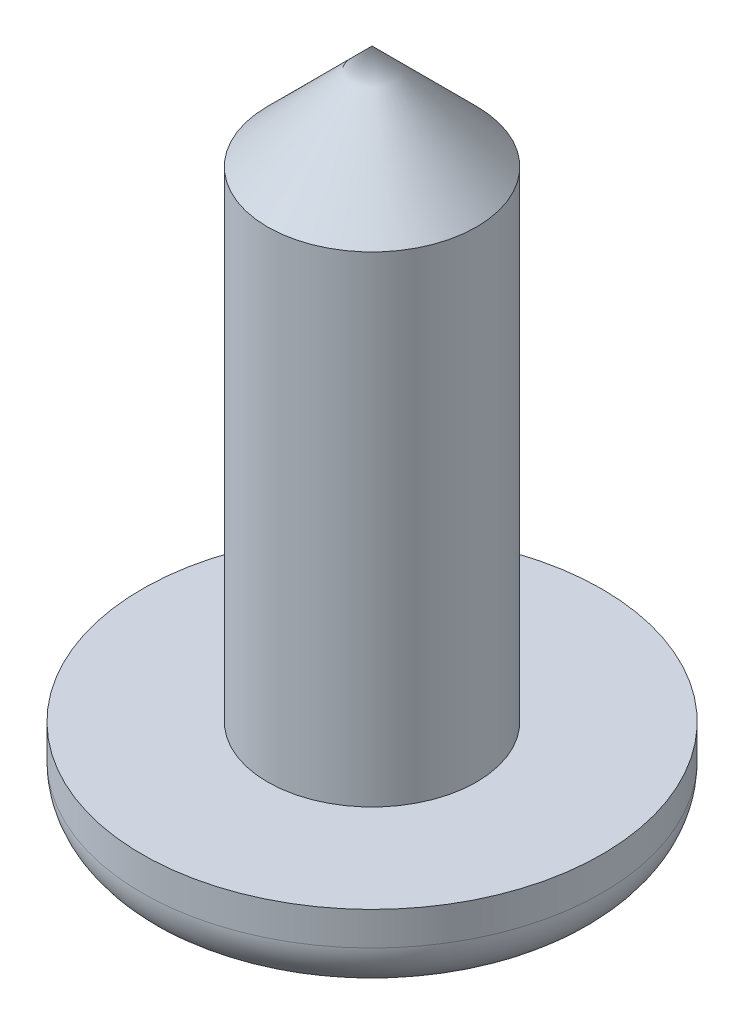
ISO-10303-21;
HEADER;
FILE_DESCRIPTION(('STEP AP214'),'2;1');
FILE_NAME('part.step','',(''),(''),'','','');
FILE_SCHEMA(('AUTOMOTIVE_DESIGN { 1 0 10303 214 1 1 1 1 }'));
ENDSEC;
DATA;
#1=APPLICATION_CONTEXT('core data for automotive mechanical design processes');
#2=APPLICATION_PROTOCOL_DEFINITION('international standard','automotive_design',2000,#1);
#3=PRODUCT_CONTEXT('',#1,'mechanical');
#4=PRODUCT('Part','Part','',(#3));
#5=PRODUCT_RELATED_PRODUCT_CATEGORY('part','',(#4));
#6=PRODUCT_DEFINITION_FORMATION('','',#4);
#7=PRODUCT_DEFINITION_CONTEXT('part definition',#1,'design');
#8=PRODUCT_DEFINITION('design','',#6,#7);
#9=PRODUCT_DEFINITION_SHAPE('','',#8);
#10=(LENGTH_UNIT() NAMED_UNIT(*) SI_UNIT(.MILLI.,.METRE.));
#11=(NAMED_UNIT(*) PLANE_ANGLE_UNIT() SI_UNIT($,.RADIAN.));
#12=(NAMED_UNIT(*) SI_UNIT($,.STERADIAN.) SOLID_ANGLE_UNIT());
#13=UNCERTAINTY_MEASURE_WITH_UNIT(LENGTH_MEASURE(1.E-05),#10,'distance_accuracy_value','');
#14=(GEOMETRIC_REPRESENTATION_CONTEXT(3) GLOBAL_UNCERTAINTY_ASSIGNED_CONTEXT((#13)) GLOBAL_UNIT_ASSIGNED_CONTEXT((#10,
#11,#12)) REPRESENTATION_CONTEXT('',''));
#15=CARTESIAN_POINT('',(0.,0.,0.));
#16=DIRECTION('',(0.,0.,1.));
#17=DIRECTION('',(1.,0.,0.));
#18=AXIS2_PLACEMENT_3D('',#15,#16,#17);
#19=CARTESIAN_POINT('',(-2.14999999999987,-1.66533453693773E-13,0.));
#20=DIRECTION('',(0.,1.,0.));
#21=DIRECTION('',(0.,0.,1.00000000000003));
#22=AXIS2_PLACEMENT_3D('',#19,#20,#21);
#23=PLANE('',#22);
#24=CARTESIAN_POINT('',(0.,0.,0.));
#25=DIRECTION('',(0.,-1.,0.));
#26=DIRECTION('',(0.,0.,-1.00000000000003));
#27=AXIS2_PLACEMENT_3D('',#24,#25,#26);
#28=CIRCLE('',#27,2.15);
#29=CARTESIAN_POINT('',(0.,0.,-2.15000000000007));
#30=VERTEX_POINT('',#29);
#31=EDGE_CURVE('E11',#30,#30,#28,.T.);
#32=ORIENTED_EDGE('',*,*,#31,.T.);
#33=EDGE_LOOP('',(#32));
#34=FACE_BOUND('',#33,.T.);
#35=DIRECTION('',(0.,0.,1.00000000000003));
#36=VECTOR('',#35,1.);
#37=CARTESIAN_POINT('',(-0.250000000000042,0.,0.));
#38=LINE('',#37,#36);
#39=CARTESIAN_POINT('',(-0.250000000000167,0.,0.250000000000097));
#40=VERTEX_POINT('',#39);
#41=CARTESIAN_POINT('',(-0.250000000000118,1.38777878078145E-13,0.999999999999928));
#42=VERTEX_POINT('',#41);
#43=EDGE_CURVE('E47',#40,#42,#38,.T.);
#44=ORIENTED_EDGE('',*,*,#43,.T.);
#45=DIRECTION('',(1.00000000000003,0.,0.));
#46=VECTOR('',#45,1.);
#47=CARTESIAN_POINT('',(-2.35922392732846E-13,-3.33066907387547E-13,1.00000000000047));
#48=LINE('',#47,#46);
#49=CARTESIAN_POINT('',(0.249999999999723,0.,1.00000000000025));
#50=VERTEX_POINT('',#49);
#51=EDGE_CURVE('E144',#42,#50,#48,.T.);
#52=ORIENTED_EDGE('',*,*,#51,.T.);
#53=DIRECTION('',(0.,0.,1.00000000000003));
#54=VECTOR('',#53,1.);
#55=CARTESIAN_POINT('',(0.249999999999806,-5.55111512312578E-13,0.));
#56=LINE('',#55,#54);
#57=CARTESIAN_POINT('',(0.249999999999556,0.,0.250000000000094));
#58=VERTEX_POINT('',#57);
#59=EDGE_CURVE('E141',#58,#50,#56,.T.);
#60=ORIENTED_EDGE('',*,*,#59,.F.);
#61=DIRECTION('',(1.00000000000003,0.,0.));
#62=VECTOR('',#61,1.);
#63=CARTESIAN_POINT('',(-3.33066907387547E-13,3.05311331771918E-13,0.249999999999966));
#64=LINE('',#63,#62);
#65=CARTESIAN_POINT('',(0.999999999999737,2.22044604925031E-13,0.24999999999991));
#66=VERTEX_POINT('',#65);
#67=EDGE_CURVE('E138',#58,#66,#64,.T.);
#68=ORIENTED_EDGE('',*,*,#67,.T.);
#69=DIRECTION('',(0.,0.,-1.00000000000003));
#70=VECTOR('',#69,1.);
#71=CARTESIAN_POINT('',(0.999999999999675,-1.11022302462516E-13,0.));
#72=LINE('',#71,#70);
#73=CARTESIAN_POINT('',(1.00000000000004,-2.4980018054066E-13,-0.250000000000122));
#74=VERTEX_POINT('',#73);
#75=EDGE_CURVE('E135',#66,#74,#72,.T.);
#76=ORIENTED_EDGE('',*,*,#75,.T.);
#77=DIRECTION('',(1.00000000000003,0.,0.));
#78=VECTOR('',#77,1.);
#79=CARTESIAN_POINT('',(0.,-6.10622663543836E-13,-0.249999999999858));
#80=LINE('',#79,#78);
#81=CARTESIAN_POINT('',(0.249999999999778,0.,-0.24999999999999));
#82=VERTEX_POINT('',#81);
#83=EDGE_CURVE('E132',#82,#74,#80,.T.);
#84=ORIENTED_EDGE('',*,*,#83,.F.);
#85=DIRECTION('',(0.,0.,1.00000000000003));
#86=VECTOR('',#85,1.);
#87=CARTESIAN_POINT('',(0.249999999999806,-5.55111512312578E-13,0.));
#88=LINE('',#87,#86);
#89=CARTESIAN_POINT('',(0.249999999999861,-1.66533453693773E-13,-0.999999999999713));
#90=VERTEX_POINT('',#89);
#91=EDGE_CURVE('E129',#90,#82,#88,.T.);
#92=ORIENTED_EDGE('',*,*,#91,.F.);
#93=DIRECTION('',(1.00000000000003,0.,0.));
#94=VECTOR('',#93,1.);
#95=CARTESIAN_POINT('',(-2.91433543964104E-13,1.94289029309402E-13,-1.00000000000008));
#96=LINE('',#95,#94);
#97=CARTESIAN_POINT('',(-0.250000000000222,-1.11022302462516E-13,-0.999999999999866));
#98=VERTEX_POINT('',#97);
#99=EDGE_CURVE('E126',#98,#90,#96,.T.);
#100=ORIENTED_EDGE('',*,*,#99,.F.);
#101=DIRECTION('',(0.,0.,1.00000000000003));
#102=VECTOR('',#101,1.);
#103=CARTESIAN_POINT('',(-0.250000000000042,0.,0.));
#104=LINE('',#103,#102);
#105=CARTESIAN_POINT('',(-0.250000000000111,0.,-0.250000000000038));
#106=VERTEX_POINT('',#105);
#107=EDGE_CURVE('E121',#98,#106,#104,.T.);
#108=ORIENTED_EDGE('',*,*,#107,.T.);
#109=DIRECTION('',(1.00000000000003,0.,0.));
#110=VECTOR('',#109,1.);
#111=CARTESIAN_POINT('',(0.,-6.10622663543836E-13,-0.249999999999858));
#112=LINE('',#111,#110);
#113=CARTESIAN_POINT('',(-1.00000000000039,-6.10622663543836E-13,-0.250000000000087));
#114=VERTEX_POINT('',#113);
#115=EDGE_CURVE('E119',#114,#106,#112,.T.);
#116=ORIENTED_EDGE('',*,*,#115,.F.);
#117=DIRECTION('',(0.,0.,-1.00000000000003));
#118=VECTOR('',#117,1.);
#119=CARTESIAN_POINT('',(-1.00000000000014,0.,0.));
#120=LINE('',#119,#118);
#121=CARTESIAN_POINT('',(-1.00000000000015,0.,0.25000000000024));
#122=VERTEX_POINT('',#121);
#123=EDGE_CURVE('E106',#122,#114,#120,.T.);
#124=ORIENTED_EDGE('',*,*,#123,.F.);
#125=DIRECTION('',(1.00000000000003,0.,0.));
#126=VECTOR('',#125,1.);
#127=CARTESIAN_POINT('',(-3.33066907387547E-13,3.05311331771918E-13,0.249999999999966));
#128=LINE('',#127,#126);
#129=EDGE_CURVE('E113',#122,#40,#128,.T.);
#130=ORIENTED_EDGE('',*,*,#129,.T.);
#131=EDGE_LOOP('',(#44,#52,#60,#68,#76,#84,#92,#100,#108,#116,#124,#130));
#132=FACE_BOUND('',#131,.T.);
#133=ADVANCED_FACE('F32',(#34,#132),#23,.F.);
#134=CARTESIAN_POINT('',(-3.88578058618805E-13,0.600000000000017,1.70002900645727E-13));
#135=DIRECTION('',(0.,-1.,0.));
#136=DIRECTION('',(0.,0.,-1.00000000000003));
#137=AXIS2_PLACEMENT_3D('',#134,#135,#136);
#138=TOROIDAL_SURFACE('',#137,2.15,0.6);
#139=ORIENTED_EDGE('',*,*,#31,.F.);
#140=EDGE_LOOP('',(#139));
#141=FACE_BOUND('',#140,.T.);
#142=CARTESIAN_POINT('',(-3.88578058618805E-13,0.600000000000017,1.70002900645727E-13));
#143=DIRECTION('',(0.,-1.,0.));
#144=DIRECTION('',(0.,0.,-1.00000000000003));
#145=AXIS2_PLACEMENT_3D('',#142,#143,#144);
#146=CIRCLE('',#145,2.75);
#147=CARTESIAN_POINT('',(-3.89799303945892E-13,0.600000000000017,-2.74999999999992));
#148=VERTEX_POINT('',#147);
#149=EDGE_CURVE('E175',#148,#148,#146,.T.);
#150=ORIENTED_EDGE('',*,*,#149,.T.);
#151=EDGE_LOOP('',(#150));
#152=FACE_BOUND('',#151,.T.);
#153=ADVANCED_FACE('F34',(#141,#152),#138,.T.);
#154=CARTESIAN_POINT('',(-6.52256026967279E-13,8.00000000000009,1.2490009027033E-13));
#155=DIRECTION('',(0.,-1.,0.));
#156=DIRECTION('',(0.,0.,-1.00000000000003));
#157=AXIS2_PLACEMENT_3D('',#154,#155,#156);
#158=CONICAL_SURFACE('',#157,0.,0.785398163397443);
#159=CARTESIAN_POINT('',(-3.88578058618805E-13,6.75000000000006,0.));
#160=DIRECTION('',(0.,-1.,0.));
#161=DIRECTION('',(0.,0.,-1.00000000000003));
#162=AXIS2_PLACEMENT_3D('',#159,#160,#161);
#163=CIRCLE('',#162,1.25);
#164=CARTESIAN_POINT('',(-3.89133170131117E-13,6.75000000000006,-1.25000000000006));
#165=VERTEX_POINT('',#164);
#166=EDGE_CURVE('E40',#165,#165,#163,.T.);
#167=ORIENTED_EDGE('',*,*,#166,.F.);
#168=EDGE_LOOP('',(#167));
#169=FACE_BOUND('',#168,.T.);
#170=CARTESIAN_POINT('',(-6.52256026967279E-13,8.00000000000009,1.2490009027033E-13));
#171=VERTEX_POINT('',#170);
#172=VERTEX_LOOP('',#171);
#173=FACE_BOUND('',#172,.T.);
#174=ADVANCED_FACE('F188',(#169,#173),#158,.T.);
#175=CARTESIAN_POINT('',(-6.52256026967279E-13,8.00000000000009,1.2490009027033E-13));
#176=DIRECTION('',(0.,-1.,0.));
#177=DIRECTION('',(0.,0.,-1.00000000000003));
#178=AXIS2_PLACEMENT_3D('',#175,#176,#177);
#179=CYLINDRICAL_SURFACE('',#178,1.25);
#180=CARTESIAN_POINT('',(-1.38777878078145E-13,1.,0.));
#181=DIRECTION('',(0.,-1.,0.));
#182=DIRECTION('',(0.,0.,-1.00000000000003));
#183=AXIS2_PLACEMENT_3D('',#180,#181,#182);
#184=CIRCLE('',#183,1.25);
#185=CARTESIAN_POINT('',(-1.39332989590457E-13,1.,-1.25000000000011));
#186=VERTEX_POINT('',#185);
#187=EDGE_CURVE('E181',#186,#186,#184,.T.);
#188=ORIENTED_EDGE('',*,*,#187,.F.);
#189=EDGE_LOOP('',(#188));
#190=FACE_BOUND('',#189,.T.);
#191=ORIENTED_EDGE('',*,*,#166,.T.);
#192=EDGE_LOOP('',(#191));
#193=FACE_BOUND('',#192,.T.);
#194=ADVANCED_FACE('F186',(#190,#193),#179,.T.);
#195=CARTESIAN_POINT('',(-1.25000000000031,1.00000000000008,-1.07552855510562E-13));
#196=DIRECTION('',(0.,-1.,0.));
#197=DIRECTION('',(0.,0.,-1.00000000000003));
#198=AXIS2_PLACEMENT_3D('',#195,#196,#197);
#199=PLANE('',#198);
#200=CARTESIAN_POINT('',(-1.38777878078145E-13,1.,0.));
#201=DIRECTION('',(0.,-1.,0.));
#202=DIRECTION('',(0.,0.,-1.00000000000003));
#203=AXIS2_PLACEMENT_3D('',#200,#201,#202);
#204=CIRCLE('',#203,2.75);
#205=CARTESIAN_POINT('',(-1.39999123405232E-13,1.,-2.75000000000016));
#206=VERTEX_POINT('',#205);
#207=EDGE_CURVE('E178',#206,#206,#204,.T.);
#208=ORIENTED_EDGE('',*,*,#207,.F.);
#209=EDGE_LOOP('',(#208));
#210=FACE_BOUND('',#209,.T.);
#211=ORIENTED_EDGE('',*,*,#187,.T.);
#212=EDGE_LOOP('',(#211));
#213=FACE_BOUND('',#212,.T.);
#214=ADVANCED_FACE('F195',(#210,#213),#199,.F.);
#215=CARTESIAN_POINT('',(-6.52256026967279E-13,8.00000000000009,1.2490009027033E-13));
#216=DIRECTION('',(0.,-1.,0.));
#217=DIRECTION('',(0.,0.,-1.00000000000003));
#218=AXIS2_PLACEMENT_3D('',#215,#216,#217);
#219=CYLINDRICAL_SURFACE('',#218,2.75);
#220=ORIENTED_EDGE('',*,*,#149,.F.);
#221=EDGE_LOOP('',(#220));
#222=FACE_BOUND('',#221,.T.);
#223=ORIENTED_EDGE('',*,*,#207,.T.);
#224=EDGE_LOOP('',(#223));
#225=FACE_BOUND('',#224,.T.);
#226=ADVANCED_FACE('F207',(#222,#225),#219,.T.);
#227=CARTESIAN_POINT('',(-0.250000000000042,0.,0.));
#228=DIRECTION('',(-0.939692620785937,0.34202014332567,0.));
#229=DIRECTION('',(-0.342020143325682,-0.939692620785909,0.));
#230=AXIS2_PLACEMENT_3D('',#227,#228,#229);
#231=PLANE('',#230);
#232=DIRECTION('',(0.,0.,-1.00000000000003));
#233=VECTOR('',#232,1.);
#234=CARTESIAN_POINT('',(-3.05311331771918E-13,0.686869354863645,1.31838984174237E-13));
#235=LINE('',#234,#233);
#236=CARTESIAN_POINT('',(-3.05311331771918E-13,0.686869354863645,1.31838984174237E-13));
#237=VERTEX_POINT('',#236);
#238=CARTESIAN_POINT('',(-2.15105711021124E-13,0.686869354863756,0.75000000000025));
#239=VERTEX_POINT('',#238);
#240=EDGE_CURVE('E149',#237,#239,#235,.F.);
#241=ORIENTED_EDGE('',*,*,#240,.T.);
#242=DIRECTION('',(-0.323615577118196,-0.889126490715991,0.323615577118197));
#243=VECTOR('',#242,1.);
#244=CARTESIAN_POINT('',(-0.223818239561809,0.0719337956060495,0.973818239561539));
#245=LINE('',#244,#243);
#246=EDGE_CURVE('E147',#239,#42,#245,.T.);
#247=ORIENTED_EDGE('',*,*,#246,.T.);
#248=ORIENTED_EDGE('',*,*,#43,.F.);
#249=DIRECTION('',(-0.323615577118196,-0.889126490715991,0.323615577118197));
#250=VECTOR('',#249,1.);
#251=CARTESIAN_POINT('',(-0.223818239561926,0.0719337956057442,0.223818239561569));
#252=LINE('',#251,#250);
#253=EDGE_CURVE('E110',#237,#40,#252,.T.);
#254=ORIENTED_EDGE('',*,*,#253,.F.);
#255=EDGE_LOOP('',(#241,#247,#248,#254));
#256=FACE_BOUND('',#255,.T.);
#257=ADVANCED_FACE('F210',(#256),#231,.F.);
#258=CARTESIAN_POINT('',(-2.35922392732846E-13,-3.33066907387547E-13,1.00000000000047));
#259=DIRECTION('',(0.,0.34202014332567,0.939692620785936));
#260=DIRECTION('',(0.,-0.939692620785909,0.342020143325682));
#261=AXIS2_PLACEMENT_3D('',#258,#259,#260);
#262=PLANE('',#261);
#263=ORIENTED_EDGE('',*,*,#51,.F.);
#264=ORIENTED_EDGE('',*,*,#246,.F.);
#265=DIRECTION('',(-0.323615577118196,0.889126490715988,-0.323615577118198));
#266=VECTOR('',#265,1.);
#267=CARTESIAN_POINT('',(0.223818239561663,0.0719337956060495,0.973818239561691));
#268=LINE('',#267,#266);
#269=EDGE_CURVE('E150',#239,#50,#268,.F.);
#270=ORIENTED_EDGE('',*,*,#269,.T.);
#271=EDGE_LOOP('',(#263,#264,#270));
#272=FACE_BOUND('',#271,.T.);
#273=ADVANCED_FACE('F221',(#272),#262,.F.);
#274=CARTESIAN_POINT('',(0.249999999999806,-5.55111512312578E-13,0.));
#275=DIRECTION('',(0.939692620785943,0.342020143325669,0.));
#276=DIRECTION('',(-0.342020143325679,0.939692620785909,0.));
#277=AXIS2_PLACEMENT_3D('',#274,#275,#276);
#278=PLANE('',#277);
#279=DIRECTION('',(-0.323615577118196,0.889126490715988,-0.323615577118198));
#280=VECTOR('',#279,1.);
#281=CARTESIAN_POINT('',(0.223818239561607,0.0719337956060218,0.223818239561618));
#282=LINE('',#281,#280);
#283=EDGE_CURVE('E165',#237,#58,#282,.F.);
#284=ORIENTED_EDGE('',*,*,#283,.T.);
#285=ORIENTED_EDGE('',*,*,#59,.T.);
#286=ORIENTED_EDGE('',*,*,#269,.F.);
#287=ORIENTED_EDGE('',*,*,#240,.F.);
#288=EDGE_LOOP('',(#284,#285,#286,#287));
#289=FACE_BOUND('',#288,.T.);
#290=ADVANCED_FACE('F224',(#289),#278,.F.);
#291=CARTESIAN_POINT('',(-3.33066907387547E-13,3.05311331771918E-13,0.249999999999966));
#292=DIRECTION('',(0.,0.34202014332567,0.939692620785936));
#293=DIRECTION('',(0.,-0.939692620785909,0.342020143325682));
#294=AXIS2_PLACEMENT_3D('',#291,#292,#293);
#295=PLANE('',#294);
#296=DIRECTION('',(-1.00000000000003,0.,0.));
#297=VECTOR('',#296,1.);
#298=CARTESIAN_POINT('',(-3.05311331771918E-13,0.686869354863645,1.31838984174237E-13));
#299=LINE('',#298,#297);
#300=CARTESIAN_POINT('',(0.749999999999806,0.686869354863229,1.66533453693773E-13));
#301=VERTEX_POINT('',#300);
#302=EDGE_CURVE('E169',#237,#301,#299,.F.);
#303=ORIENTED_EDGE('',*,*,#302,.T.);
#304=DIRECTION('',(0.323615577118196,-0.889126490715988,0.323615577118198));
#305=VECTOR('',#304,1.);
#306=CARTESIAN_POINT('',(0.973818239561441,0.0719337956062438,0.223818239561392));
#307=LINE('',#306,#305);
#308=EDGE_CURVE('E163',#301,#66,#307,.T.);
#309=ORIENTED_EDGE('',*,*,#308,.T.);
#310=ORIENTED_EDGE('',*,*,#67,.F.);
#311=ORIENTED_EDGE('',*,*,#283,.F.);
#312=EDGE_LOOP('',(#303,#309,#310,#311));
#313=FACE_BOUND('',#312,.T.);
#314=ADVANCED_FACE('F228',(#313),#295,.F.);
#315=CARTESIAN_POINT('',(0.999999999999675,-1.11022302462516E-13,0.));
#316=DIRECTION('',(0.939692620785943,0.342020143325669,0.));
#317=DIRECTION('',(-0.342020143325679,0.939692620785909,0.));
#318=AXIS2_PLACEMENT_3D('',#315,#316,#317);
#319=PLANE('',#318);
#320=ORIENTED_EDGE('',*,*,#75,.F.);
#321=ORIENTED_EDGE('',*,*,#308,.F.);
#322=DIRECTION('',(-0.323615577118197,0.889126490715987,0.323615577118196));
#323=VECTOR('',#322,1.);
#324=CARTESIAN_POINT('',(0.973818239561525,0.0719337956056054,-0.223818239561673));
#325=LINE('',#324,#323);
#326=EDGE_CURVE('E161',#301,#74,#325,.F.);
#327=ORIENTED_EDGE('',*,*,#326,.T.);
#328=EDGE_LOOP('',(#320,#321,#327));
#329=FACE_BOUND('',#328,.T.);
#330=ADVANCED_FACE('F232',(#329),#319,.F.);
#331=CARTESIAN_POINT('',(0.,-6.10622663543836E-13,-0.249999999999858));
#332=DIRECTION('',(0.,0.34202014332567,-0.939692620785945));
#333=DIRECTION('',(0.,0.939692620785909,0.34202014332568));
#334=AXIS2_PLACEMENT_3D('',#331,#332,#333);
#335=PLANE('',#334);
#336=DIRECTION('',(0.323615577118197,-0.889126490715987,-0.323615577118196));
#337=VECTOR('',#336,1.);
#338=CARTESIAN_POINT('',(0.22381823956133,0.0719337956060218,-0.223818239561559));
#339=LINE('',#338,#337);
#340=EDGE_CURVE('E159',#237,#82,#339,.T.);
#341=ORIENTED_EDGE('',*,*,#340,.T.);
#342=ORIENTED_EDGE('',*,*,#83,.T.);
#343=ORIENTED_EDGE('',*,*,#326,.F.);
#344=ORIENTED_EDGE('',*,*,#302,.F.);
#345=EDGE_LOOP('',(#341,#342,#343,#344));
#346=FACE_BOUND('',#345,.T.);
#347=ADVANCED_FACE('F236',(#346),#335,.F.);
#348=CARTESIAN_POINT('',(0.249999999999806,-5.55111512312578E-13,0.));
#349=DIRECTION('',(0.939692620785943,0.342020143325669,0.));
#350=DIRECTION('',(-0.342020143325679,0.939692620785909,0.));
#351=AXIS2_PLACEMENT_3D('',#348,#349,#350);
#352=PLANE('',#351);
#353=DIRECTION('',(0.,0.,1.00000000000003));
#354=VECTOR('',#353,1.);
#355=CARTESIAN_POINT('',(-3.05311331771918E-13,0.686869354863645,1.31838984174237E-13));
#356=LINE('',#355,#354);
#357=CARTESIAN_POINT('',(-2.22044604925031E-13,0.686869354863284,-0.74999999999989));
#358=VERTEX_POINT('',#357);
#359=EDGE_CURVE('E171',#237,#358,#356,.F.);
#360=ORIENTED_EDGE('',*,*,#359,.T.);
#361=DIRECTION('',(0.323615577118197,-0.889126490715987,-0.323615577118196));
#362=VECTOR('',#361,1.);
#363=CARTESIAN_POINT('',(0.223818239561434,0.0719337956059107,-0.973818239561646));
#364=LINE('',#363,#362);
#365=EDGE_CURVE('E157',#358,#90,#364,.T.);
#366=ORIENTED_EDGE('',*,*,#365,.T.);
#367=ORIENTED_EDGE('',*,*,#91,.T.);
#368=ORIENTED_EDGE('',*,*,#340,.F.);
#369=EDGE_LOOP('',(#360,#366,#367,#368));
#370=FACE_BOUND('',#369,.T.);
#371=ADVANCED_FACE('F240',(#370),#352,.F.);
#372=CARTESIAN_POINT('',(-2.91433543964104E-13,1.94289029309402E-13,-1.00000000000008));
#373=DIRECTION('',(0.,0.34202014332567,-0.939692620785945));
#374=DIRECTION('',(0.,0.939692620785909,0.34202014332568));
#375=AXIS2_PLACEMENT_3D('',#372,#373,#374);
#376=PLANE('',#375);
#377=ORIENTED_EDGE('',*,*,#99,.T.);
#378=ORIENTED_EDGE('',*,*,#365,.F.);
#379=DIRECTION('',(0.323615577118196,0.889126490715989,0.323615577118195));
#380=VECTOR('',#379,1.);
#381=CARTESIAN_POINT('',(-0.223818239561802,0.0719337956057164,-0.973818239561695));
#382=LINE('',#381,#380);
#383=EDGE_CURVE('E155',#358,#98,#382,.F.);
#384=ORIENTED_EDGE('',*,*,#383,.T.);
#385=EDGE_LOOP('',(#377,#378,#384));
#386=FACE_BOUND('',#385,.T.);
#387=ADVANCED_FACE('F245',(#386),#376,.F.);
#388=CARTESIAN_POINT('',(-0.250000000000042,0.,0.));
#389=DIRECTION('',(-0.939692620785937,0.34202014332567,0.));
#390=DIRECTION('',(-0.342020143325682,-0.939692620785909,0.));
#391=AXIS2_PLACEMENT_3D('',#388,#389,#390);
#392=PLANE('',#391);
#393=DIRECTION('',(0.323615577118196,0.889126490715989,0.323615577118195));
#394=VECTOR('',#393,1.);
#395=CARTESIAN_POINT('',(-0.223818239561697,0.0719337956061328,-0.223818239561864));
#396=LINE('',#395,#394);
#397=EDGE_CURVE('E153',#237,#106,#396,.F.);
#398=ORIENTED_EDGE('',*,*,#397,.T.);
#399=ORIENTED_EDGE('',*,*,#107,.F.);
#400=ORIENTED_EDGE('',*,*,#383,.F.);
#401=ORIENTED_EDGE('',*,*,#359,.F.);
#402=EDGE_LOOP('',(#398,#399,#400,#401));
#403=FACE_BOUND('',#402,.T.);
#404=ADVANCED_FACE('F249',(#403),#392,.F.);
#405=DIRECTION('',(1.00000000000003,0.,0.));
#406=VECTOR('',#405,1.);
#407=CARTESIAN_POINT('',(-3.05311331771918E-13,0.686869354863645,1.31838984174237E-13));
#408=LINE('',#407,#406);
#409=CARTESIAN_POINT('',(-0.750000000000674,0.686869354863701,2.77555756156289E-13));
#410=VERTEX_POINT('',#409);
#411=EDGE_CURVE('E173',#237,#410,#408,.F.);
#412=ORIENTED_EDGE('',*,*,#411,.T.);
#413=DIRECTION('',(-0.323615577118196,-0.889126490715989,-0.323615577118195));
#414=VECTOR('',#413,1.);
#415=CARTESIAN_POINT('',(-0.973818239561872,0.0719337956054111,-0.223818239561909));
#416=LINE('',#415,#414);
#417=EDGE_CURVE('E108',#410,#114,#416,.T.);
#418=ORIENTED_EDGE('',*,*,#417,.T.);
#419=ORIENTED_EDGE('',*,*,#115,.T.);
#420=ORIENTED_EDGE('',*,*,#397,.F.);
#421=EDGE_LOOP('',(#412,#418,#419,#420));
#422=FACE_BOUND('',#421,.T.);
#423=ADVANCED_FACE('F242',(#422),#335,.F.);
#424=CARTESIAN_POINT('',(-1.00000000000014,0.,0.));
#425=DIRECTION('',(-0.939692620785937,0.34202014332567,0.));
#426=DIRECTION('',(-0.342020143325682,-0.939692620785909,0.));
#427=AXIS2_PLACEMENT_3D('',#424,#425,#426);
#428=PLANE('',#427);
#429=ORIENTED_EDGE('',*,*,#123,.T.);
#430=ORIENTED_EDGE('',*,*,#417,.F.);
#431=DIRECTION('',(0.323615577118196,0.889126490715991,-0.323615577118197));
#432=VECTOR('',#431,1.);
#433=CARTESIAN_POINT('',(-0.973818239561899,0.0719337956061605,0.22381823956176));
#434=LINE('',#433,#432);
#435=EDGE_CURVE('E102',#410,#122,#434,.F.);
#436=ORIENTED_EDGE('',*,*,#435,.T.);
#437=EDGE_LOOP('',(#429,#430,#436));
#438=FACE_BOUND('',#437,.T.);
#439=ADVANCED_FACE('F104',(#438),#428,.F.);
#440=ORIENTED_EDGE('',*,*,#253,.T.);
#441=ORIENTED_EDGE('',*,*,#129,.F.);
#442=ORIENTED_EDGE('',*,*,#435,.F.);
#443=ORIENTED_EDGE('',*,*,#411,.F.);
#444=EDGE_LOOP('',(#440,#441,#442,#443));
#445=FACE_BOUND('',#444,.T.);
#446=ADVANCED_FACE('F114',(#445),#295,.F.);
#447=CLOSED_SHELL('',(#133,#153,#174,#194,#214,#226,#257,#273,#290,#314,#330,#347,#371,#387,
#404,#423,#439,#446));
#448=MANIFOLD_SOLID_BREP('B2',#447);
#449=ADVANCED_BREP_SHAPE_REPRESENTATION('',(#18,#448),#14);
#450=SHAPE_DEFINITION_REPRESENTATION(#9,#449);
ENDSEC;
END-ISO-10303-21;
